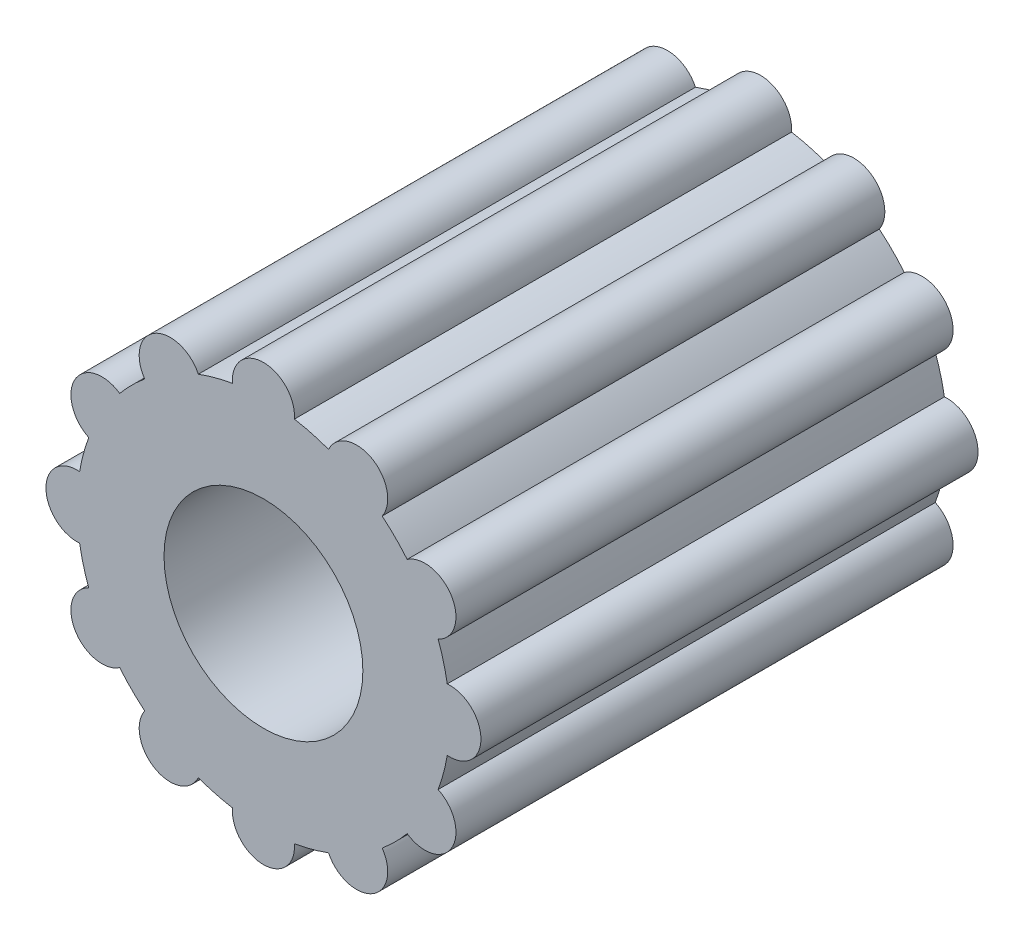
ISO-10303-21;
HEADER;
FILE_DESCRIPTION(('STEP AP214'),'2;1');
FILE_NAME('part.step','',(''),(''),'','','');
FILE_SCHEMA(('AUTOMOTIVE_DESIGN { 1 0 10303 214 1 1 1 1 }'));
ENDSEC;
DATA;
#1=APPLICATION_CONTEXT('core data for automotive mechanical design processes');
#2=APPLICATION_PROTOCOL_DEFINITION('international standard','automotive_design',2000,#1);
#3=PRODUCT_CONTEXT('',#1,'mechanical');
#4=PRODUCT('Part','Part','',(#3));
#5=PRODUCT_RELATED_PRODUCT_CATEGORY('part','',(#4));
#6=PRODUCT_DEFINITION_FORMATION('','',#4);
#7=PRODUCT_DEFINITION_CONTEXT('part definition',#1,'design');
#8=PRODUCT_DEFINITION('design','',#6,#7);
#9=PRODUCT_DEFINITION_SHAPE('','',#8);
#10=(LENGTH_UNIT() NAMED_UNIT(*) SI_UNIT(.MILLI.,.METRE.));
#11=(NAMED_UNIT(*) PLANE_ANGLE_UNIT() SI_UNIT($,.RADIAN.));
#12=(NAMED_UNIT(*) SI_UNIT($,.STERADIAN.) SOLID_ANGLE_UNIT());
#13=UNCERTAINTY_MEASURE_WITH_UNIT(LENGTH_MEASURE(1.E-05),#10,'distance_accuracy_value','');
#14=(GEOMETRIC_REPRESENTATION_CONTEXT(3) GLOBAL_UNCERTAINTY_ASSIGNED_CONTEXT((#13)) GLOBAL_UNIT_ASSIGNED_CONTEXT((#10,
#11,#12)) REPRESENTATION_CONTEXT('',''));
#15=CARTESIAN_POINT('',(0.,0.,0.));
#16=DIRECTION('',(0.,0.,1.));
#17=DIRECTION('',(1.,0.,0.));
#18=AXIS2_PLACEMENT_3D('',#15,#16,#17);
#19=CARTESIAN_POINT('',(0.,0.750000000000084,3.99999999999997));
#20=DIRECTION('',(0.,0.,0.999999999999981));
#21=DIRECTION('',(1.,0.,0.));
#22=AXIS2_PLACEMENT_3D('',#19,#20,#21);
#23=PLANE('',#22);
#24=CARTESIAN_POINT('',(0.,0.,3.99999999999996));
#25=DIRECTION('',(0.,0.,0.999999999999981));
#26=DIRECTION('',(1.,0.,0.));
#27=AXIS2_PLACEMENT_3D('',#24,#25,#26);
#28=CIRCLE('',#27,1.5);
#29=CARTESIAN_POINT('',(0.52383005023733,1.40556112583846,4.00000000000002));
#30=VERTEX_POINT('',#29);
#31=CARTESIAN_POINT('',(0.249130432147845,1.47916666666667,4.00000000000005));
#32=VERTEX_POINT('',#31);
#33=EDGE_CURVE('E293',#30,#32,#28,.T.);
#34=ORIENTED_EDGE('',*,*,#33,.T.);
#35=CARTESIAN_POINT('',(-1.25767452008319E-13,1.5000000000001,3.99999999999999));
#36=DIRECTION('',(0.,0.,0.999999999999981));
#37=DIRECTION('',(1.,0.,0.));
#38=AXIS2_PLACEMENT_3D('',#35,#36,#37);
#39=CIRCLE('',#38,0.25);
#40=CARTESIAN_POINT('',(-0.249130432148013,1.47916666666679,4.00000000000002));
#41=VERTEX_POINT('',#40);
#42=EDGE_CURVE('E161',#32,#41,#39,.T.);
#43=ORIENTED_EDGE('',*,*,#42,.T.);
#44=CARTESIAN_POINT('',(0.,0.,3.99999999999996));
#45=DIRECTION('',(0.,0.,0.999999999999981));
#46=DIRECTION('',(1.,0.,0.));
#47=AXIS2_PLACEMENT_3D('',#44,#45,#46);
#48=CIRCLE('',#47,1.49999999999999);
#49=CARTESIAN_POINT('',(-0.523830050237603,1.40556112583858,4.00000000000004));
#50=VERTEX_POINT('',#49);
#51=EDGE_CURVE('E356',#41,#50,#48,.T.);
#52=ORIENTED_EDGE('',*,*,#51,.T.);
#53=CARTESIAN_POINT('',(-0.750000000000156,1.29903810567679,4.00000000000001));
#54=DIRECTION('',(0.,0.,0.999999999999981));
#55=DIRECTION('',(1.,0.,0.));
#56=AXIS2_PLACEMENT_3D('',#53,#54,#55);
#57=CIRCLE('',#56,0.25);
#58=CARTESIAN_POINT('',(-0.955336616429422,1.15643069369062,4.00000000000003));
#59=VERTEX_POINT('',#58);
#60=EDGE_CURVE('E375',#50,#59,#57,.T.);
#61=ORIENTED_EDGE('',*,*,#60,.T.);
#62=CARTESIAN_POINT('',(0.,0.,3.99999999999996));
#63=DIRECTION('',(0.,0.,0.999999999999981));
#64=DIRECTION('',(1.,0.,0.));
#65=AXIS2_PLACEMENT_3D('',#62,#63,#64);
#66=CIRCLE('',#65,1.5);
#67=CARTESIAN_POINT('',(-1.15643069369056,0.955336616429329,4.));
#68=VERTEX_POINT('',#67);
#69=EDGE_CURVE('E372',#59,#68,#66,.T.);
#70=ORIENTED_EDGE('',*,*,#69,.T.);
#71=CARTESIAN_POINT('',(-1.29903810567668,0.750000000000039,3.99999999999996));
#72=DIRECTION('',(0.,0.,0.999999999999981));
#73=DIRECTION('',(1.,0.,0.));
#74=AXIS2_PLACEMENT_3D('',#71,#72,#73);
#75=CIRCLE('',#74,0.25);
#76=CARTESIAN_POINT('',(-1.40556112583854,0.523830050237404,3.99999999999998));
#77=VERTEX_POINT('',#76);
#78=EDGE_CURVE('E374',#68,#77,#75,.T.);
#79=ORIENTED_EDGE('',*,*,#78,.T.);
#80=CARTESIAN_POINT('',(0.,0.,3.99999999999996));
#81=DIRECTION('',(0.,0.,0.999999999999981));
#82=DIRECTION('',(1.,0.,0.));
#83=AXIS2_PLACEMENT_3D('',#80,#81,#82);
#84=CIRCLE('',#83,1.5);
#85=CARTESIAN_POINT('',(-1.47916666666678,0.24913043214795,3.99999999999995));
#86=VERTEX_POINT('',#85);
#87=EDGE_CURVE('E377',#77,#86,#84,.T.);
#88=ORIENTED_EDGE('',*,*,#87,.T.);
#89=CARTESIAN_POINT('',(-1.50000000000004,0.,4.));
#90=DIRECTION('',(0.,0.,0.999999999999981));
#91=DIRECTION('',(1.,0.,0.));
#92=AXIS2_PLACEMENT_3D('',#89,#90,#91);
#93=CIRCLE('',#92,0.25);
#94=CARTESIAN_POINT('',(-1.47916666666671,-0.249130432147932,3.99999999999996));
#95=VERTEX_POINT('',#94);
#96=EDGE_CURVE('E383',#86,#95,#93,.T.);
#97=ORIENTED_EDGE('',*,*,#96,.T.);
#98=CARTESIAN_POINT('',(0.,0.,3.99999999999996));
#99=DIRECTION('',(0.,0.,0.999999999999981));
#100=DIRECTION('',(1.,0.,0.));
#101=AXIS2_PLACEMENT_3D('',#98,#99,#100);
#102=CIRCLE('',#101,1.49999999999999);
#103=CARTESIAN_POINT('',(-1.40556112583857,-0.523830050237439,3.99999999999996));
#104=VERTEX_POINT('',#103);
#105=EDGE_CURVE('E385',#95,#104,#102,.T.);
#106=ORIENTED_EDGE('',*,*,#105,.T.);
#107=CARTESIAN_POINT('',(-1.29903810567671,-0.749999999999966,3.99999999999998));
#108=DIRECTION('',(0.,0.,0.999999999999981));
#109=DIRECTION('',(1.,0.,0.));
#110=AXIS2_PLACEMENT_3D('',#107,#108,#109);
#111=CIRCLE('',#110,0.25);
#112=CARTESIAN_POINT('',(-1.1564306936905,-0.955336616429187,3.99999999999998));
#113=VERTEX_POINT('',#112);
#114=EDGE_CURVE('E387',#104,#113,#111,.T.);
#115=ORIENTED_EDGE('',*,*,#114,.T.);
#116=CARTESIAN_POINT('',(0.,0.,3.99999999999996));
#117=DIRECTION('',(0.,0.,0.999999999999981));
#118=DIRECTION('',(1.,0.,0.));
#119=AXIS2_PLACEMENT_3D('',#116,#117,#118);
#120=CIRCLE('',#119,1.5);
#121=CARTESIAN_POINT('',(-0.955336616429346,-1.15643069369051,4.));
#122=VERTEX_POINT('',#121);
#123=EDGE_CURVE('E389',#113,#122,#120,.T.);
#124=ORIENTED_EDGE('',*,*,#123,.T.);
#125=CARTESIAN_POINT('',(-0.750000000000119,-1.29903810567669,4.));
#126=DIRECTION('',(0.,0.,0.999999999999981));
#127=DIRECTION('',(1.,0.,0.));
#128=AXIS2_PLACEMENT_3D('',#125,#126,#127);
#129=CIRCLE('',#128,0.25);
#130=CARTESIAN_POINT('',(-0.523830050237574,-1.40556112583836,4.00000000000001));
#131=VERTEX_POINT('',#130);
#132=EDGE_CURVE('E391',#122,#131,#129,.T.);
#133=ORIENTED_EDGE('',*,*,#132,.T.);
#134=CARTESIAN_POINT('',(0.,0.,3.99999999999996));
#135=DIRECTION('',(0.,0.,0.999999999999981));
#136=DIRECTION('',(1.,0.,0.));
#137=AXIS2_PLACEMENT_3D('',#134,#135,#136);
#138=CIRCLE('',#137,1.5);
#139=CARTESIAN_POINT('',(-0.249130432148061,-1.47916666666654,3.99999999999996));
#140=VERTEX_POINT('',#139);
#141=EDGE_CURVE('E393',#131,#140,#138,.T.);
#142=ORIENTED_EDGE('',*,*,#141,.T.);
#143=CARTESIAN_POINT('',(0.,-1.50000000000003,4.00000000000001));
#144=DIRECTION('',(0.,0.,0.999999999999981));
#145=DIRECTION('',(1.,0.,0.));
#146=AXIS2_PLACEMENT_3D('',#143,#144,#145);
#147=CIRCLE('',#146,0.25);
#148=CARTESIAN_POINT('',(0.249130432147785,-1.47916666666668,3.99999999999997));
#149=VERTEX_POINT('',#148);
#150=EDGE_CURVE('E395',#140,#149,#147,.T.);
#151=ORIENTED_EDGE('',*,*,#150,.T.);
#152=CARTESIAN_POINT('',(0.,0.,3.99999999999996));
#153=DIRECTION('',(0.,0.,0.999999999999981));
#154=DIRECTION('',(1.,0.,0.));
#155=AXIS2_PLACEMENT_3D('',#152,#153,#154);
#156=CIRCLE('',#155,1.5);
#157=CARTESIAN_POINT('',(0.52383005023729,-1.4055611258384,4.));
#158=VERTEX_POINT('',#157);
#159=EDGE_CURVE('E397',#149,#158,#156,.T.);
#160=ORIENTED_EDGE('',*,*,#159,.T.);
#161=CARTESIAN_POINT('',(0.750000000000028,-1.29903810567655,4.));
#162=DIRECTION('',(0.,0.,0.999999999999981));
#163=DIRECTION('',(1.,0.,0.));
#164=AXIS2_PLACEMENT_3D('',#161,#162,#163);
#165=CIRCLE('',#164,0.25);
#166=CARTESIAN_POINT('',(0.955336616429257,-1.15643069369045,4.00000000000001));
#167=VERTEX_POINT('',#166);
#168=EDGE_CURVE('E399',#158,#167,#165,.T.);
#169=ORIENTED_EDGE('',*,*,#168,.T.);
#170=CARTESIAN_POINT('',(0.,0.,3.99999999999996));
#171=DIRECTION('',(0.,0.,0.999999999999981));
#172=DIRECTION('',(1.,0.,0.));
#173=AXIS2_PLACEMENT_3D('',#170,#171,#172);
#174=CIRCLE('',#173,1.5);
#175=CARTESIAN_POINT('',(1.15643069369054,-0.955336616429082,3.99999999999998));
#176=VERTEX_POINT('',#175);
#177=EDGE_CURVE('E401',#167,#176,#174,.T.);
#178=ORIENTED_EDGE('',*,*,#177,.T.);
#179=CARTESIAN_POINT('',(1.29903810567669,-0.749999999999976,4.));
#180=DIRECTION('',(0.,0.,0.999999999999981));
#181=DIRECTION('',(1.,0.,0.));
#182=AXIS2_PLACEMENT_3D('',#179,#180,#181);
#183=CIRCLE('',#182,0.25);
#184=CARTESIAN_POINT('',(1.40556112583831,-0.523830050237293,4.00000000000001));
#185=VERTEX_POINT('',#184);
#186=EDGE_CURVE('E403',#176,#185,#183,.T.);
#187=ORIENTED_EDGE('',*,*,#186,.T.);
#188=CARTESIAN_POINT('',(0.,0.,3.99999999999996));
#189=DIRECTION('',(0.,0.,0.999999999999981));
#190=DIRECTION('',(1.,0.,0.));
#191=AXIS2_PLACEMENT_3D('',#188,#189,#190);
#192=CIRCLE('',#191,1.5);
#193=CARTESIAN_POINT('',(1.47916666666659,-0.249130432147835,4.));
#194=VERTEX_POINT('',#193);
#195=EDGE_CURVE('E405',#185,#194,#192,.T.);
#196=ORIENTED_EDGE('',*,*,#195,.T.);
#197=CARTESIAN_POINT('',(1.49999999999999,0.,4.00000000000002));
#198=DIRECTION('',(0.,0.,0.999999999999981));
#199=DIRECTION('',(1.,0.,0.));
#200=AXIS2_PLACEMENT_3D('',#197,#198,#199);
#201=CIRCLE('',#200,0.25);
#202=CARTESIAN_POINT('',(1.47916666666648,0.249130432147967,3.99999999999996));
#203=VERTEX_POINT('',#202);
#204=EDGE_CURVE('E407',#194,#203,#201,.T.);
#205=ORIENTED_EDGE('',*,*,#204,.T.);
#206=CARTESIAN_POINT('',(0.,0.,3.99999999999996));
#207=DIRECTION('',(0.,0.,0.999999999999981));
#208=DIRECTION('',(1.,0.,0.));
#209=AXIS2_PLACEMENT_3D('',#206,#207,#208);
#210=CIRCLE('',#209,1.5);
#211=CARTESIAN_POINT('',(1.40556112583846,0.523830050237446,3.99999999999997));
#212=VERTEX_POINT('',#211);
#213=EDGE_CURVE('E228',#203,#212,#210,.T.);
#214=ORIENTED_EDGE('',*,*,#213,.T.);
#215=CARTESIAN_POINT('',(1.29903810567657,0.749999999999962,3.99999999999998));
#216=DIRECTION('',(0.,0.,0.999999999999981));
#217=DIRECTION('',(1.,0.,0.));
#218=AXIS2_PLACEMENT_3D('',#215,#216,#217);
#219=CIRCLE('',#218,0.25);
#220=CARTESIAN_POINT('',(1.15643069369041,0.955336616429409,4.));
#221=VERTEX_POINT('',#220);
#222=EDGE_CURVE('E222',#212,#221,#219,.T.);
#223=ORIENTED_EDGE('',*,*,#222,.T.);
#224=CARTESIAN_POINT('',(0.,0.,3.99999999999996));
#225=DIRECTION('',(0.,0.,0.999999999999981));
#226=DIRECTION('',(1.,0.,0.));
#227=AXIS2_PLACEMENT_3D('',#224,#225,#226);
#228=CIRCLE('',#227,1.5);
#229=CARTESIAN_POINT('',(0.955336616429131,1.15643069369062,4.00000000000006));
#230=VERTEX_POINT('',#229);
#231=EDGE_CURVE('E226',#221,#230,#228,.T.);
#232=ORIENTED_EDGE('',*,*,#231,.T.);
#233=CARTESIAN_POINT('',(0.749999999999856,1.2990381056768,4.00000000000005));
#234=DIRECTION('',(0.,0.,0.999999999999981));
#235=DIRECTION('',(1.,0.,0.));
#236=AXIS2_PLACEMENT_3D('',#233,#234,#235);
#237=CIRCLE('',#236,0.25);
#238=EDGE_CURVE('E70',#230,#30,#237,.T.);
#239=ORIENTED_EDGE('',*,*,#238,.T.);
#240=EDGE_LOOP('',(#34,#43,#52,#61,#70,#79,#88,#97,#106,#115,#124,#133,#142,#151,#160,#169,#178,
#187,#196,#205,#214,#223,#232,#239));
#241=FACE_BOUND('',#240,.T.);
#242=CARTESIAN_POINT('',(0.,0.,3.99999999999994));
#243=DIRECTION('',(0.,0.,-0.999999999999981));
#244=DIRECTION('',(-1.,0.,0.));
#245=AXIS2_PLACEMENT_3D('',#242,#243,#244);
#246=CIRCLE('',#245,0.799999999999999);
#247=CARTESIAN_POINT('',(-0.800000000000037,0.,3.99999999999994));
#248=VERTEX_POINT('',#247);
#249=EDGE_CURVE('E250',#248,#248,#246,.T.);
#250=ORIENTED_EDGE('',*,*,#249,.T.);
#251=EDGE_LOOP('',(#250));
#252=FACE_BOUND('',#251,.T.);
#253=ADVANCED_FACE('F53',(#241,#252),#23,.T.);
#254=CARTESIAN_POINT('',(-1.10154940724527E-13,0.75000000000006,0.));
#255=DIRECTION('',(0.,0.,0.999999999999981));
#256=DIRECTION('',(1.,0.,0.));
#257=AXIS2_PLACEMENT_3D('',#254,#255,#256);
#258=PLANE('',#257);
#259=CARTESIAN_POINT('',(0.,0.,0.));
#260=DIRECTION('',(0.,0.,0.999999999999981));
#261=DIRECTION('',(1.,0.,0.));
#262=AXIS2_PLACEMENT_3D('',#259,#260,#261);
#263=CIRCLE('',#262,1.5);
#264=CARTESIAN_POINT('',(0.523830050237322,1.4055611258385,0.));
#265=VERTEX_POINT('',#264);
#266=CARTESIAN_POINT('',(0.249130432147879,1.4791666666667,0.));
#267=VERTEX_POINT('',#266);
#268=EDGE_CURVE('E246',#265,#267,#263,.T.);
#269=ORIENTED_EDGE('',*,*,#268,.F.);
#270=CARTESIAN_POINT('',(0.749999999999891,1.2990381056768,0.));
#271=DIRECTION('',(0.,0.,0.999999999999981));
#272=DIRECTION('',(1.,0.,0.));
#273=AXIS2_PLACEMENT_3D('',#270,#271,#272);
#274=CIRCLE('',#273,0.25);
#275=CARTESIAN_POINT('',(0.955336616429159,1.1564306936906,0.));
#276=VERTEX_POINT('',#275);
#277=EDGE_CURVE('E153',#276,#265,#274,.T.);
#278=ORIENTED_EDGE('',*,*,#277,.F.);
#279=CARTESIAN_POINT('',(0.,0.,0.));
#280=DIRECTION('',(0.,0.,0.999999999999981));
#281=DIRECTION('',(1.,0.,0.));
#282=AXIS2_PLACEMENT_3D('',#279,#280,#281);
#283=CIRCLE('',#282,1.5);
#284=CARTESIAN_POINT('',(1.15643069369041,0.95533661642945,0.));
#285=VERTEX_POINT('',#284);
#286=EDGE_CURVE('E147',#285,#276,#283,.T.);
#287=ORIENTED_EDGE('',*,*,#286,.F.);
#288=CARTESIAN_POINT('',(1.29903810567659,0.750000000000032,0.));
#289=DIRECTION('',(0.,0.,0.999999999999981));
#290=DIRECTION('',(1.,0.,0.));
#291=AXIS2_PLACEMENT_3D('',#288,#289,#290);
#292=CIRCLE('',#291,0.25);
#293=CARTESIAN_POINT('',(1.4055611258384,0.52383005023747,0.));
#294=VERTEX_POINT('',#293);
#295=EDGE_CURVE('E236',#294,#285,#292,.T.);
#296=ORIENTED_EDGE('',*,*,#295,.F.);
#297=CARTESIAN_POINT('',(0.,0.,0.));
#298=DIRECTION('',(0.,0.,0.999999999999981));
#299=DIRECTION('',(1.,0.,0.));
#300=AXIS2_PLACEMENT_3D('',#297,#298,#299);
#301=CIRCLE('',#300,1.5);
#302=CARTESIAN_POINT('',(1.47916666666643,0.249130432148002,0.));
#303=VERTEX_POINT('',#302);
#304=EDGE_CURVE('E288',#303,#294,#301,.T.);
#305=ORIENTED_EDGE('',*,*,#304,.F.);
#306=CARTESIAN_POINT('',(1.50000000000002,0.,0.));
#307=DIRECTION('',(0.,0.,0.999999999999981));
#308=DIRECTION('',(1.,0.,0.));
#309=AXIS2_PLACEMENT_3D('',#306,#307,#308);
#310=CIRCLE('',#309,0.25);
#311=CARTESIAN_POINT('',(1.47916666666655,-0.249130432147849,0.));
#312=VERTEX_POINT('',#311);
#313=EDGE_CURVE('E286',#312,#303,#310,.T.);
#314=ORIENTED_EDGE('',*,*,#313,.F.);
#315=CARTESIAN_POINT('',(0.,0.,0.));
#316=DIRECTION('',(0.,0.,0.999999999999981));
#317=DIRECTION('',(1.,0.,0.));
#318=AXIS2_PLACEMENT_3D('',#315,#316,#317);
#319=CIRCLE('',#318,1.5);
#320=CARTESIAN_POINT('',(1.40556112583835,-0.523830050237314,0.));
#321=VERTEX_POINT('',#320);
#322=EDGE_CURVE('E284',#321,#312,#319,.T.);
#323=ORIENTED_EDGE('',*,*,#322,.F.);
#324=CARTESIAN_POINT('',(1.29903810567667,-0.7499999999999,0.));
#325=DIRECTION('',(0.,0.,0.999999999999981));
#326=DIRECTION('',(1.,0.,0.));
#327=AXIS2_PLACEMENT_3D('',#324,#325,#326);
#328=CIRCLE('',#327,0.25);
#329=CARTESIAN_POINT('',(1.15643069369045,-0.955336616429086,0.));
#330=VERTEX_POINT('',#329);
#331=EDGE_CURVE('E282',#330,#321,#328,.T.);
#332=ORIENTED_EDGE('',*,*,#331,.F.);
#333=CARTESIAN_POINT('',(0.,0.,0.));
#334=DIRECTION('',(0.,0.,0.999999999999981));
#335=DIRECTION('',(1.,0.,0.));
#336=AXIS2_PLACEMENT_3D('',#333,#334,#335);
#337=CIRCLE('',#336,1.5);
#338=CARTESIAN_POINT('',(0.955336616429312,-1.15643069369037,0.));
#339=VERTEX_POINT('',#338);
#340=EDGE_CURVE('E280',#339,#330,#337,.T.);
#341=ORIENTED_EDGE('',*,*,#340,.F.);
#342=CARTESIAN_POINT('',(0.749999999999987,-1.29903810567648,0.));
#343=DIRECTION('',(0.,0.,0.999999999999981));
#344=DIRECTION('',(1.,0.,0.));
#345=AXIS2_PLACEMENT_3D('',#342,#343,#344);
#346=CIRCLE('',#345,0.25);
#347=CARTESIAN_POINT('',(0.523830050237205,-1.40556112583839,0.));
#348=VERTEX_POINT('',#347);
#349=EDGE_CURVE('E278',#348,#339,#346,.T.);
#350=ORIENTED_EDGE('',*,*,#349,.F.);
#351=CARTESIAN_POINT('',(0.,0.,0.));
#352=DIRECTION('',(0.,0.,0.999999999999981));
#353=DIRECTION('',(1.,0.,0.));
#354=AXIS2_PLACEMENT_3D('',#351,#352,#353);
#355=CIRCLE('',#354,1.5);
#356=CARTESIAN_POINT('',(0.249130432147784,-1.47916666666665,0.));
#357=VERTEX_POINT('',#356);
#358=EDGE_CURVE('E276',#357,#348,#355,.T.);
#359=ORIENTED_EDGE('',*,*,#358,.F.);
#360=CARTESIAN_POINT('',(0.,-1.50000000000003,0.));
#361=DIRECTION('',(0.,0.,0.999999999999981));
#362=DIRECTION('',(1.,0.,0.));
#363=AXIS2_PLACEMENT_3D('',#360,#361,#362);
#364=CIRCLE('',#363,0.25);
#365=CARTESIAN_POINT('',(-0.249130432148178,-1.4791666666665,0.));
#366=VERTEX_POINT('',#365);
#367=EDGE_CURVE('E274',#366,#357,#364,.T.);
#368=ORIENTED_EDGE('',*,*,#367,.F.);
#369=CARTESIAN_POINT('',(0.,0.,0.));
#370=DIRECTION('',(0.,0.,0.999999999999981));
#371=DIRECTION('',(1.,0.,0.));
#372=AXIS2_PLACEMENT_3D('',#369,#370,#371);
#373=CIRCLE('',#372,1.5);
#374=CARTESIAN_POINT('',(-0.523830050237587,-1.40556112583835,0.));
#375=VERTEX_POINT('',#374);
#376=EDGE_CURVE('E272',#375,#366,#373,.T.);
#377=ORIENTED_EDGE('',*,*,#376,.F.);
#378=CARTESIAN_POINT('',(-0.75000000000018,-1.29903810567662,0.));
#379=DIRECTION('',(0.,0.,0.999999999999981));
#380=DIRECTION('',(1.,0.,0.));
#381=AXIS2_PLACEMENT_3D('',#378,#379,#380);
#382=CIRCLE('',#381,0.25);
#383=CARTESIAN_POINT('',(-0.955336616429324,-1.15643069369045,0.));
#384=VERTEX_POINT('',#383);
#385=EDGE_CURVE('E270',#384,#375,#382,.T.);
#386=ORIENTED_EDGE('',*,*,#385,.F.);
#387=CARTESIAN_POINT('',(0.,0.,0.));
#388=DIRECTION('',(0.,0.,0.999999999999981));
#389=DIRECTION('',(1.,0.,0.));
#390=AXIS2_PLACEMENT_3D('',#387,#388,#389);
#391=CIRCLE('',#390,1.5);
#392=CARTESIAN_POINT('',(-1.15643069369051,-0.955336616429117,0.));
#393=VERTEX_POINT('',#392);
#394=EDGE_CURVE('E268',#393,#384,#391,.T.);
#395=ORIENTED_EDGE('',*,*,#394,.F.);
#396=CARTESIAN_POINT('',(-1.2990381056767,-0.749999999999942,0.));
#397=DIRECTION('',(0.,0.,0.999999999999981));
#398=DIRECTION('',(1.,0.,0.));
#399=AXIS2_PLACEMENT_3D('',#396,#397,#398);
#400=CIRCLE('',#399,0.25);
#401=CARTESIAN_POINT('',(-1.40556112583855,-0.523830050237355,0.));
#402=VERTEX_POINT('',#401);
#403=EDGE_CURVE('E266',#402,#393,#400,.T.);
#404=ORIENTED_EDGE('',*,*,#403,.F.);
#405=CARTESIAN_POINT('',(0.,0.,0.));
#406=DIRECTION('',(0.,0.,0.999999999999981));
#407=DIRECTION('',(1.,0.,0.));
#408=AXIS2_PLACEMENT_3D('',#405,#406,#407);
#409=CIRCLE('',#408,1.49999999999999);
#410=CARTESIAN_POINT('',(-1.4791666666667,-0.249130432147911,0.));
#411=VERTEX_POINT('',#410);
#412=EDGE_CURVE('E264',#411,#402,#409,.T.);
#413=ORIENTED_EDGE('',*,*,#412,.F.);
#414=CARTESIAN_POINT('',(-1.5000000000001,0.,0.));
#415=DIRECTION('',(0.,0.,0.999999999999981));
#416=DIRECTION('',(1.,0.,0.));
#417=AXIS2_PLACEMENT_3D('',#414,#415,#416);
#418=CIRCLE('',#417,0.25);
#419=CARTESIAN_POINT('',(-1.47916666666672,0.249130432147998,0.));
#420=VERTEX_POINT('',#419);
#421=EDGE_CURVE('E262',#420,#411,#418,.T.);
#422=ORIENTED_EDGE('',*,*,#421,.F.);
#423=CARTESIAN_POINT('',(0.,0.,0.));
#424=DIRECTION('',(0.,0.,0.999999999999981));
#425=DIRECTION('',(1.,0.,0.));
#426=AXIS2_PLACEMENT_3D('',#423,#424,#425);
#427=CIRCLE('',#426,1.5);
#428=CARTESIAN_POINT('',(-1.40556112583856,0.523830050237442,0.));
#429=VERTEX_POINT('',#428);
#430=EDGE_CURVE('E260',#429,#420,#427,.T.);
#431=ORIENTED_EDGE('',*,*,#430,.F.);
#432=CARTESIAN_POINT('',(-1.29903810567672,0.750000000000035,0.));
#433=DIRECTION('',(0.,0.,0.999999999999981));
#434=DIRECTION('',(1.,0.,0.));
#435=AXIS2_PLACEMENT_3D('',#432,#433,#434);
#436=CIRCLE('',#435,0.25);
#437=CARTESIAN_POINT('',(-1.15643069369062,0.955336616429415,0.));
#438=VERTEX_POINT('',#437);
#439=EDGE_CURVE('E258',#438,#429,#436,.T.);
#440=ORIENTED_EDGE('',*,*,#439,.F.);
#441=CARTESIAN_POINT('',(0.,0.,0.));
#442=DIRECTION('',(0.,0.,0.999999999999981));
#443=DIRECTION('',(1.,0.,0.));
#444=AXIS2_PLACEMENT_3D('',#441,#442,#443);
#445=CIRCLE('',#444,1.5);
#446=CARTESIAN_POINT('',(-0.955336616429402,1.15643069369063,0.));
#447=VERTEX_POINT('',#446);
#448=EDGE_CURVE('E256',#447,#438,#445,.T.);
#449=ORIENTED_EDGE('',*,*,#448,.F.);
#450=CARTESIAN_POINT('',(-0.750000000000161,1.29903810567679,0.));
#451=DIRECTION('',(0.,0.,0.999999999999981));
#452=DIRECTION('',(1.,0.,0.));
#453=AXIS2_PLACEMENT_3D('',#450,#451,#452);
#454=CIRCLE('',#453,0.25);
#455=CARTESIAN_POINT('',(-0.52383005023761,1.40556112583861,0.));
#456=VERTEX_POINT('',#455);
#457=EDGE_CURVE('E254',#456,#447,#454,.T.);
#458=ORIENTED_EDGE('',*,*,#457,.F.);
#459=CARTESIAN_POINT('',(0.,0.,0.));
#460=DIRECTION('',(0.,0.,0.999999999999981));
#461=DIRECTION('',(1.,0.,0.));
#462=AXIS2_PLACEMENT_3D('',#459,#460,#461);
#463=CIRCLE('',#462,1.49999999999999);
#464=CARTESIAN_POINT('',(-0.249130432147971,1.47916666666682,0.));
#465=VERTEX_POINT('',#464);
#466=EDGE_CURVE('E252',#465,#456,#463,.T.);
#467=ORIENTED_EDGE('',*,*,#466,.F.);
#468=CARTESIAN_POINT('',(-1.17961196366423E-13,1.50000000000015,0.));
#469=DIRECTION('',(0.,0.,0.999999999999981));
#470=DIRECTION('',(1.,0.,0.));
#471=AXIS2_PLACEMENT_3D('',#468,#469,#470);
#472=CIRCLE('',#471,0.25);
#473=EDGE_CURVE('E249',#267,#465,#472,.T.);
#474=ORIENTED_EDGE('',*,*,#473,.F.);
#475=EDGE_LOOP('',(#269,#278,#287,#296,#305,#314,#323,#332,#341,#350,#359,#368,#377,#386,#395,
#404,#413,#422,#431,#440,#449,#458,#467,#474));
#476=FACE_BOUND('',#475,.T.);
#477=CARTESIAN_POINT('',(0.,0.,0.));
#478=DIRECTION('',(0.,0.,-0.999999999999981));
#479=DIRECTION('',(-1.,0.,0.));
#480=AXIS2_PLACEMENT_3D('',#477,#478,#479);
#481=CIRCLE('',#480,0.799999999999988);
#482=CARTESIAN_POINT('',(-0.800000000000037,0.,0.));
#483=VERTEX_POINT('',#482);
#484=EDGE_CURVE('E712',#483,#483,#481,.T.);
#485=ORIENTED_EDGE('',*,*,#484,.F.);
#486=EDGE_LOOP('',(#485));
#487=FACE_BOUND('',#486,.T.);
#488=ADVANCED_FACE('F360',(#476,#487),#258,.F.);
#489=CARTESIAN_POINT('',(0.,0.,3.99999999999996));
#490=DIRECTION('',(0.,0.,-0.999999999999981));
#491=DIRECTION('',(-1.,0.,0.));
#492=AXIS2_PLACEMENT_3D('',#489,#490,#491);
#493=CYLINDRICAL_SURFACE('',#492,1.5);
#494=ORIENTED_EDGE('',*,*,#268,.T.);
#495=DIRECTION('',(0.,0.,-0.999999999999981));
#496=VECTOR('',#495,1.);
#497=CARTESIAN_POINT('',(0.249130432147845,1.47916666666667,4.00000000000005));
#498=LINE('',#497,#496);
#499=EDGE_CURVE('E13',#32,#267,#498,.T.);
#500=ORIENTED_EDGE('',*,*,#499,.F.);
#501=ORIENTED_EDGE('',*,*,#33,.F.);
#502=DIRECTION('',(0.,0.,-0.999999999999981));
#503=VECTOR('',#502,1.);
#504=CARTESIAN_POINT('',(0.52383005023733,1.40556112583846,4.00000000000002));
#505=LINE('',#504,#503);
#506=EDGE_CURVE('E242',#30,#265,#505,.T.);
#507=ORIENTED_EDGE('',*,*,#506,.T.);
#508=EDGE_LOOP('',(#494,#500,#501,#507));
#509=FACE_BOUND('',#508,.T.);
#510=ADVANCED_FACE('F55',(#509),#493,.T.);
#511=CARTESIAN_POINT('',(-1.25767452008319E-13,1.5000000000001,3.99999999999999));
#512=DIRECTION('',(0.,0.,-0.999999999999981));
#513=DIRECTION('',(-1.,0.,0.));
#514=AXIS2_PLACEMENT_3D('',#511,#512,#513);
#515=CYLINDRICAL_SURFACE('',#514,0.25);
#516=ORIENTED_EDGE('',*,*,#473,.T.);
#517=DIRECTION('',(0.,0.,-0.999999999999981));
#518=VECTOR('',#517,1.);
#519=CARTESIAN_POINT('',(-0.249130432148013,1.47916666666679,4.00000000000002));
#520=LINE('',#519,#518);
#521=EDGE_CURVE('E62',#41,#465,#520,.T.);
#522=ORIENTED_EDGE('',*,*,#521,.F.);
#523=ORIENTED_EDGE('',*,*,#42,.F.);
#524=ORIENTED_EDGE('',*,*,#499,.T.);
#525=EDGE_LOOP('',(#516,#522,#523,#524));
#526=FACE_BOUND('',#525,.T.);
#527=ADVANCED_FACE('F441',(#526),#515,.T.);
#528=CARTESIAN_POINT('',(0.,0.,3.99999999999996));
#529=DIRECTION('',(0.,0.,-0.999999999999981));
#530=DIRECTION('',(-1.,0.,0.));
#531=AXIS2_PLACEMENT_3D('',#528,#529,#530);
#532=CYLINDRICAL_SURFACE('',#531,1.49999999999999);
#533=ORIENTED_EDGE('',*,*,#466,.T.);
#534=DIRECTION('',(0.,0.,-0.999999999999981));
#535=VECTOR('',#534,1.);
#536=CARTESIAN_POINT('',(-0.523830050237603,1.40556112583858,4.00000000000004));
#537=LINE('',#536,#535);
#538=EDGE_CURVE('E348',#50,#456,#537,.T.);
#539=ORIENTED_EDGE('',*,*,#538,.F.);
#540=ORIENTED_EDGE('',*,*,#51,.F.);
#541=ORIENTED_EDGE('',*,*,#521,.T.);
#542=EDGE_LOOP('',(#533,#539,#540,#541));
#543=FACE_BOUND('',#542,.T.);
#544=ADVANCED_FACE('F354',(#543),#532,.T.);
#545=CARTESIAN_POINT('',(-0.750000000000156,1.29903810567679,4.00000000000001));
#546=DIRECTION('',(0.,0.,-0.999999999999981));
#547=DIRECTION('',(-1.,0.,0.));
#548=AXIS2_PLACEMENT_3D('',#545,#546,#547);
#549=CYLINDRICAL_SURFACE('',#548,0.25);
#550=ORIENTED_EDGE('',*,*,#457,.T.);
#551=DIRECTION('',(0.,0.,-0.999999999999981));
#552=VECTOR('',#551,1.);
#553=CARTESIAN_POINT('',(-0.955336616429422,1.15643069369062,4.00000000000003));
#554=LINE('',#553,#552);
#555=EDGE_CURVE('E345',#59,#447,#554,.T.);
#556=ORIENTED_EDGE('',*,*,#555,.F.);
#557=ORIENTED_EDGE('',*,*,#60,.F.);
#558=ORIENTED_EDGE('',*,*,#538,.T.);
#559=EDGE_LOOP('',(#550,#556,#557,#558));
#560=FACE_BOUND('',#559,.T.);
#561=ADVANCED_FACE('F366',(#560),#549,.T.);
#562=CARTESIAN_POINT('',(0.,0.,3.99999999999996));
#563=DIRECTION('',(0.,0.,-0.999999999999981));
#564=DIRECTION('',(-1.,0.,0.));
#565=AXIS2_PLACEMENT_3D('',#562,#563,#564);
#566=CYLINDRICAL_SURFACE('',#565,1.5);
#567=ORIENTED_EDGE('',*,*,#448,.T.);
#568=DIRECTION('',(0.,0.,-0.999999999999981));
#569=VECTOR('',#568,1.);
#570=CARTESIAN_POINT('',(-1.15643069369056,0.955336616429329,4.));
#571=LINE('',#570,#569);
#572=EDGE_CURVE('E342',#68,#438,#571,.T.);
#573=ORIENTED_EDGE('',*,*,#572,.F.);
#574=ORIENTED_EDGE('',*,*,#69,.F.);
#575=ORIENTED_EDGE('',*,*,#555,.T.);
#576=EDGE_LOOP('',(#567,#573,#574,#575));
#577=FACE_BOUND('',#576,.T.);
#578=ADVANCED_FACE('F370',(#577),#566,.T.);
#579=CARTESIAN_POINT('',(-1.29903810567668,0.750000000000039,3.99999999999996));
#580=DIRECTION('',(0.,0.,-0.999999999999981));
#581=DIRECTION('',(-1.,0.,0.));
#582=AXIS2_PLACEMENT_3D('',#579,#580,#581);
#583=CYLINDRICAL_SURFACE('',#582,0.25);
#584=ORIENTED_EDGE('',*,*,#439,.T.);
#585=DIRECTION('',(0.,0.,-0.999999999999981));
#586=VECTOR('',#585,1.);
#587=CARTESIAN_POINT('',(-1.40556112583854,0.523830050237404,3.99999999999998));
#588=LINE('',#587,#586);
#589=EDGE_CURVE('E339',#77,#429,#588,.T.);
#590=ORIENTED_EDGE('',*,*,#589,.F.);
#591=ORIENTED_EDGE('',*,*,#78,.F.);
#592=ORIENTED_EDGE('',*,*,#572,.T.);
#593=EDGE_LOOP('',(#584,#590,#591,#592));
#594=FACE_BOUND('',#593,.T.);
#595=ADVANCED_FACE('F454',(#594),#583,.T.);
#596=CARTESIAN_POINT('',(0.,0.,3.99999999999996));
#597=DIRECTION('',(0.,0.,-0.999999999999981));
#598=DIRECTION('',(-1.,0.,0.));
#599=AXIS2_PLACEMENT_3D('',#596,#597,#598);
#600=CYLINDRICAL_SURFACE('',#599,1.5);
#601=ORIENTED_EDGE('',*,*,#430,.T.);
#602=DIRECTION('',(0.,0.,-0.999999999999981));
#603=VECTOR('',#602,1.);
#604=CARTESIAN_POINT('',(-1.47916666666678,0.24913043214795,3.99999999999995));
#605=LINE('',#604,#603);
#606=EDGE_CURVE('E336',#86,#420,#605,.T.);
#607=ORIENTED_EDGE('',*,*,#606,.F.);
#608=ORIENTED_EDGE('',*,*,#87,.F.);
#609=ORIENTED_EDGE('',*,*,#589,.T.);
#610=EDGE_LOOP('',(#601,#607,#608,#609));
#611=FACE_BOUND('',#610,.T.);
#612=ADVANCED_FACE('F457',(#611),#600,.T.);
#613=CARTESIAN_POINT('',(-1.50000000000004,0.,4.));
#614=DIRECTION('',(0.,0.,-0.999999999999981));
#615=DIRECTION('',(-1.,0.,0.));
#616=AXIS2_PLACEMENT_3D('',#613,#614,#615);
#617=CYLINDRICAL_SURFACE('',#616,0.25);
#618=ORIENTED_EDGE('',*,*,#421,.T.);
#619=DIRECTION('',(0.,0.,-0.999999999999981));
#620=VECTOR('',#619,1.);
#621=CARTESIAN_POINT('',(-1.47916666666671,-0.249130432147932,3.99999999999996));
#622=LINE('',#621,#620);
#623=EDGE_CURVE('E333',#95,#411,#622,.T.);
#624=ORIENTED_EDGE('',*,*,#623,.F.);
#625=ORIENTED_EDGE('',*,*,#96,.F.);
#626=ORIENTED_EDGE('',*,*,#606,.T.);
#627=EDGE_LOOP('',(#618,#624,#625,#626));
#628=FACE_BOUND('',#627,.T.);
#629=ADVANCED_FACE('F461',(#628),#617,.T.);
#630=CARTESIAN_POINT('',(0.,0.,3.99999999999996));
#631=DIRECTION('',(0.,0.,-0.999999999999981));
#632=DIRECTION('',(-1.,0.,0.));
#633=AXIS2_PLACEMENT_3D('',#630,#631,#632);
#634=CYLINDRICAL_SURFACE('',#633,1.49999999999999);
#635=ORIENTED_EDGE('',*,*,#412,.T.);
#636=DIRECTION('',(0.,0.,-0.999999999999981));
#637=VECTOR('',#636,1.);
#638=CARTESIAN_POINT('',(-1.40556112583857,-0.523830050237439,3.99999999999996));
#639=LINE('',#638,#637);
#640=EDGE_CURVE('E330',#104,#402,#639,.T.);
#641=ORIENTED_EDGE('',*,*,#640,.F.);
#642=ORIENTED_EDGE('',*,*,#105,.F.);
#643=ORIENTED_EDGE('',*,*,#623,.T.);
#644=EDGE_LOOP('',(#635,#641,#642,#643));
#645=FACE_BOUND('',#644,.T.);
#646=ADVANCED_FACE('F465',(#645),#634,.T.);
#647=CARTESIAN_POINT('',(-1.29903810567671,-0.749999999999966,3.99999999999998));
#648=DIRECTION('',(0.,0.,-0.999999999999981));
#649=DIRECTION('',(-1.,0.,0.));
#650=AXIS2_PLACEMENT_3D('',#647,#648,#649);
#651=CYLINDRICAL_SURFACE('',#650,0.25);
#652=ORIENTED_EDGE('',*,*,#403,.T.);
#653=DIRECTION('',(0.,0.,-0.999999999999981));
#654=VECTOR('',#653,1.);
#655=CARTESIAN_POINT('',(-1.1564306936905,-0.955336616429187,3.99999999999998));
#656=LINE('',#655,#654);
#657=EDGE_CURVE('E327',#113,#393,#656,.T.);
#658=ORIENTED_EDGE('',*,*,#657,.F.);
#659=ORIENTED_EDGE('',*,*,#114,.F.);
#660=ORIENTED_EDGE('',*,*,#640,.T.);
#661=EDGE_LOOP('',(#652,#658,#659,#660));
#662=FACE_BOUND('',#661,.T.);
#663=ADVANCED_FACE('F469',(#662),#651,.T.);
#664=CARTESIAN_POINT('',(0.,0.,3.99999999999996));
#665=DIRECTION('',(0.,0.,-0.999999999999981));
#666=DIRECTION('',(-1.,0.,0.));
#667=AXIS2_PLACEMENT_3D('',#664,#665,#666);
#668=CYLINDRICAL_SURFACE('',#667,1.5);
#669=ORIENTED_EDGE('',*,*,#394,.T.);
#670=DIRECTION('',(0.,0.,-0.999999999999981));
#671=VECTOR('',#670,1.);
#672=CARTESIAN_POINT('',(-0.955336616429346,-1.15643069369051,4.));
#673=LINE('',#672,#671);
#674=EDGE_CURVE('E324',#122,#384,#673,.T.);
#675=ORIENTED_EDGE('',*,*,#674,.F.);
#676=ORIENTED_EDGE('',*,*,#123,.F.);
#677=ORIENTED_EDGE('',*,*,#657,.T.);
#678=EDGE_LOOP('',(#669,#675,#676,#677));
#679=FACE_BOUND('',#678,.T.);
#680=ADVANCED_FACE('F473',(#679),#668,.T.);
#681=CARTESIAN_POINT('',(-0.750000000000119,-1.29903810567669,4.));
#682=DIRECTION('',(0.,0.,-0.999999999999981));
#683=DIRECTION('',(-1.,0.,0.));
#684=AXIS2_PLACEMENT_3D('',#681,#682,#683);
#685=CYLINDRICAL_SURFACE('',#684,0.25);
#686=ORIENTED_EDGE('',*,*,#385,.T.);
#687=DIRECTION('',(0.,0.,-0.999999999999981));
#688=VECTOR('',#687,1.);
#689=CARTESIAN_POINT('',(-0.523830050237574,-1.40556112583836,4.00000000000001));
#690=LINE('',#689,#688);
#691=EDGE_CURVE('E321',#131,#375,#690,.T.);
#692=ORIENTED_EDGE('',*,*,#691,.F.);
#693=ORIENTED_EDGE('',*,*,#132,.F.);
#694=ORIENTED_EDGE('',*,*,#674,.T.);
#695=EDGE_LOOP('',(#686,#692,#693,#694));
#696=FACE_BOUND('',#695,.T.);
#697=ADVANCED_FACE('F477',(#696),#685,.T.);
#698=CARTESIAN_POINT('',(0.,0.,3.99999999999996));
#699=DIRECTION('',(0.,0.,-0.999999999999981));
#700=DIRECTION('',(-1.,0.,0.));
#701=AXIS2_PLACEMENT_3D('',#698,#699,#700);
#702=CYLINDRICAL_SURFACE('',#701,1.5);
#703=ORIENTED_EDGE('',*,*,#376,.T.);
#704=DIRECTION('',(0.,0.,-0.999999999999981));
#705=VECTOR('',#704,1.);
#706=CARTESIAN_POINT('',(-0.249130432148061,-1.47916666666654,3.99999999999996));
#707=LINE('',#706,#705);
#708=EDGE_CURVE('E318',#140,#366,#707,.T.);
#709=ORIENTED_EDGE('',*,*,#708,.F.);
#710=ORIENTED_EDGE('',*,*,#141,.F.);
#711=ORIENTED_EDGE('',*,*,#691,.T.);
#712=EDGE_LOOP('',(#703,#709,#710,#711));
#713=FACE_BOUND('',#712,.T.);
#714=ADVANCED_FACE('F481',(#713),#702,.T.);
#715=CARTESIAN_POINT('',(0.,-1.50000000000003,4.00000000000001));
#716=DIRECTION('',(0.,0.,-0.999999999999981));
#717=DIRECTION('',(-1.,0.,0.));
#718=AXIS2_PLACEMENT_3D('',#715,#716,#717);
#719=CYLINDRICAL_SURFACE('',#718,0.25);
#720=ORIENTED_EDGE('',*,*,#367,.T.);
#721=DIRECTION('',(0.,0.,-0.999999999999981));
#722=VECTOR('',#721,1.);
#723=CARTESIAN_POINT('',(0.249130432147785,-1.47916666666668,3.99999999999997));
#724=LINE('',#723,#722);
#725=EDGE_CURVE('E315',#149,#357,#724,.T.);
#726=ORIENTED_EDGE('',*,*,#725,.F.);
#727=ORIENTED_EDGE('',*,*,#150,.F.);
#728=ORIENTED_EDGE('',*,*,#708,.T.);
#729=EDGE_LOOP('',(#720,#726,#727,#728));
#730=FACE_BOUND('',#729,.T.);
#731=ADVANCED_FACE('F485',(#730),#719,.T.);
#732=CARTESIAN_POINT('',(0.,0.,3.99999999999996));
#733=DIRECTION('',(0.,0.,-0.999999999999981));
#734=DIRECTION('',(-1.,0.,0.));
#735=AXIS2_PLACEMENT_3D('',#732,#733,#734);
#736=CYLINDRICAL_SURFACE('',#735,1.5);
#737=ORIENTED_EDGE('',*,*,#358,.T.);
#738=DIRECTION('',(0.,0.,-0.999999999999981));
#739=VECTOR('',#738,1.);
#740=CARTESIAN_POINT('',(0.52383005023729,-1.4055611258384,4.));
#741=LINE('',#740,#739);
#742=EDGE_CURVE('E312',#158,#348,#741,.T.);
#743=ORIENTED_EDGE('',*,*,#742,.F.);
#744=ORIENTED_EDGE('',*,*,#159,.F.);
#745=ORIENTED_EDGE('',*,*,#725,.T.);
#746=EDGE_LOOP('',(#737,#743,#744,#745));
#747=FACE_BOUND('',#746,.T.);
#748=ADVANCED_FACE('F489',(#747),#736,.T.);
#749=CARTESIAN_POINT('',(0.750000000000028,-1.29903810567655,4.));
#750=DIRECTION('',(0.,0.,-0.999999999999981));
#751=DIRECTION('',(-1.,0.,0.));
#752=AXIS2_PLACEMENT_3D('',#749,#750,#751);
#753=CYLINDRICAL_SURFACE('',#752,0.25);
#754=ORIENTED_EDGE('',*,*,#349,.T.);
#755=DIRECTION('',(0.,0.,-0.999999999999981));
#756=VECTOR('',#755,1.);
#757=CARTESIAN_POINT('',(0.955336616429257,-1.15643069369045,4.00000000000001));
#758=LINE('',#757,#756);
#759=EDGE_CURVE('E309',#167,#339,#758,.T.);
#760=ORIENTED_EDGE('',*,*,#759,.F.);
#761=ORIENTED_EDGE('',*,*,#168,.F.);
#762=ORIENTED_EDGE('',*,*,#742,.T.);
#763=EDGE_LOOP('',(#754,#760,#761,#762));
#764=FACE_BOUND('',#763,.T.);
#765=ADVANCED_FACE('F493',(#764),#753,.T.);
#766=CARTESIAN_POINT('',(0.,0.,3.99999999999996));
#767=DIRECTION('',(0.,0.,-0.999999999999981));
#768=DIRECTION('',(-1.,0.,0.));
#769=AXIS2_PLACEMENT_3D('',#766,#767,#768);
#770=CYLINDRICAL_SURFACE('',#769,1.5);
#771=ORIENTED_EDGE('',*,*,#340,.T.);
#772=DIRECTION('',(0.,0.,-0.999999999999981));
#773=VECTOR('',#772,1.);
#774=CARTESIAN_POINT('',(1.15643069369054,-0.955336616429082,3.99999999999998));
#775=LINE('',#774,#773);
#776=EDGE_CURVE('E306',#176,#330,#775,.T.);
#777=ORIENTED_EDGE('',*,*,#776,.F.);
#778=ORIENTED_EDGE('',*,*,#177,.F.);
#779=ORIENTED_EDGE('',*,*,#759,.T.);
#780=EDGE_LOOP('',(#771,#777,#778,#779));
#781=FACE_BOUND('',#780,.T.);
#782=ADVANCED_FACE('F497',(#781),#770,.T.);
#783=CARTESIAN_POINT('',(1.29903810567669,-0.749999999999976,4.));
#784=DIRECTION('',(0.,0.,-0.999999999999981));
#785=DIRECTION('',(-1.,0.,0.));
#786=AXIS2_PLACEMENT_3D('',#783,#784,#785);
#787=CYLINDRICAL_SURFACE('',#786,0.25);
#788=ORIENTED_EDGE('',*,*,#331,.T.);
#789=DIRECTION('',(0.,0.,-0.999999999999981));
#790=VECTOR('',#789,1.);
#791=CARTESIAN_POINT('',(1.40556112583831,-0.523830050237293,4.00000000000001));
#792=LINE('',#791,#790);
#793=EDGE_CURVE('E303',#185,#321,#792,.T.);
#794=ORIENTED_EDGE('',*,*,#793,.F.);
#795=ORIENTED_EDGE('',*,*,#186,.F.);
#796=ORIENTED_EDGE('',*,*,#776,.T.);
#797=EDGE_LOOP('',(#788,#794,#795,#796));
#798=FACE_BOUND('',#797,.T.);
#799=ADVANCED_FACE('F501',(#798),#787,.T.);
#800=CARTESIAN_POINT('',(0.,0.,3.99999999999996));
#801=DIRECTION('',(0.,0.,-0.999999999999981));
#802=DIRECTION('',(-1.,0.,0.));
#803=AXIS2_PLACEMENT_3D('',#800,#801,#802);
#804=CYLINDRICAL_SURFACE('',#803,1.5);
#805=ORIENTED_EDGE('',*,*,#322,.T.);
#806=DIRECTION('',(0.,0.,-0.999999999999981));
#807=VECTOR('',#806,1.);
#808=CARTESIAN_POINT('',(1.47916666666659,-0.249130432147835,4.));
#809=LINE('',#808,#807);
#810=EDGE_CURVE('E300',#194,#312,#809,.T.);
#811=ORIENTED_EDGE('',*,*,#810,.F.);
#812=ORIENTED_EDGE('',*,*,#195,.F.);
#813=ORIENTED_EDGE('',*,*,#793,.T.);
#814=EDGE_LOOP('',(#805,#811,#812,#813));
#815=FACE_BOUND('',#814,.T.);
#816=ADVANCED_FACE('F505',(#815),#804,.T.);
#817=CARTESIAN_POINT('',(1.49999999999999,0.,4.00000000000002));
#818=DIRECTION('',(0.,0.,-0.999999999999981));
#819=DIRECTION('',(-1.,0.,0.));
#820=AXIS2_PLACEMENT_3D('',#817,#818,#819);
#821=CYLINDRICAL_SURFACE('',#820,0.25);
#822=ORIENTED_EDGE('',*,*,#313,.T.);
#823=DIRECTION('',(0.,0.,-0.999999999999981));
#824=VECTOR('',#823,1.);
#825=CARTESIAN_POINT('',(1.47916666666648,0.249130432147967,3.99999999999996));
#826=LINE('',#825,#824);
#827=EDGE_CURVE('E297',#203,#303,#826,.T.);
#828=ORIENTED_EDGE('',*,*,#827,.F.);
#829=ORIENTED_EDGE('',*,*,#204,.F.);
#830=ORIENTED_EDGE('',*,*,#810,.T.);
#831=EDGE_LOOP('',(#822,#828,#829,#830));
#832=FACE_BOUND('',#831,.T.);
#833=ADVANCED_FACE('F413',(#832),#821,.T.);
#834=CARTESIAN_POINT('',(0.,0.,3.99999999999996));
#835=DIRECTION('',(0.,0.,-0.999999999999981));
#836=DIRECTION('',(-1.,0.,0.));
#837=AXIS2_PLACEMENT_3D('',#834,#835,#836);
#838=CYLINDRICAL_SURFACE('',#837,1.5);
#839=ORIENTED_EDGE('',*,*,#304,.T.);
#840=DIRECTION('',(0.,0.,-0.999999999999981));
#841=VECTOR('',#840,1.);
#842=CARTESIAN_POINT('',(1.40556112583846,0.523830050237446,3.99999999999997));
#843=LINE('',#842,#841);
#844=EDGE_CURVE('E237',#212,#294,#843,.T.);
#845=ORIENTED_EDGE('',*,*,#844,.F.);
#846=ORIENTED_EDGE('',*,*,#213,.F.);
#847=ORIENTED_EDGE('',*,*,#827,.T.);
#848=EDGE_LOOP('',(#839,#845,#846,#847));
#849=FACE_BOUND('',#848,.T.);
#850=ADVANCED_FACE('F417',(#849),#838,.T.);
#851=CARTESIAN_POINT('',(1.29903810567657,0.749999999999962,3.99999999999998));
#852=DIRECTION('',(0.,0.,-0.999999999999981));
#853=DIRECTION('',(-1.,0.,0.));
#854=AXIS2_PLACEMENT_3D('',#851,#852,#853);
#855=CYLINDRICAL_SURFACE('',#854,0.25);
#856=ORIENTED_EDGE('',*,*,#295,.T.);
#857=DIRECTION('',(0.,0.,-0.999999999999981));
#858=VECTOR('',#857,1.);
#859=CARTESIAN_POINT('',(1.15643069369041,0.955336616429409,4.));
#860=LINE('',#859,#858);
#861=EDGE_CURVE('E233',#221,#285,#860,.T.);
#862=ORIENTED_EDGE('',*,*,#861,.F.);
#863=ORIENTED_EDGE('',*,*,#222,.F.);
#864=ORIENTED_EDGE('',*,*,#844,.T.);
#865=EDGE_LOOP('',(#856,#862,#863,#864));
#866=FACE_BOUND('',#865,.T.);
#867=ADVANCED_FACE('F234',(#866),#855,.T.);
#868=CARTESIAN_POINT('',(0.,0.,3.99999999999996));
#869=DIRECTION('',(0.,0.,-0.999999999999981));
#870=DIRECTION('',(-1.,0.,0.));
#871=AXIS2_PLACEMENT_3D('',#868,#869,#870);
#872=CYLINDRICAL_SURFACE('',#871,1.5);
#873=ORIENTED_EDGE('',*,*,#286,.T.);
#874=DIRECTION('',(0.,0.,-0.999999999999981));
#875=VECTOR('',#874,1.);
#876=CARTESIAN_POINT('',(0.955336616429131,1.15643069369062,4.00000000000006));
#877=LINE('',#876,#875);
#878=EDGE_CURVE('E238',#230,#276,#877,.T.);
#879=ORIENTED_EDGE('',*,*,#878,.F.);
#880=ORIENTED_EDGE('',*,*,#231,.F.);
#881=ORIENTED_EDGE('',*,*,#861,.T.);
#882=EDGE_LOOP('',(#873,#879,#880,#881));
#883=FACE_BOUND('',#882,.T.);
#884=ADVANCED_FACE('F240',(#883),#872,.T.);
#885=CARTESIAN_POINT('',(0.749999999999856,1.2990381056768,4.00000000000005));
#886=DIRECTION('',(0.,0.,-0.999999999999981));
#887=DIRECTION('',(-1.,0.,0.));
#888=AXIS2_PLACEMENT_3D('',#885,#886,#887);
#889=CYLINDRICAL_SURFACE('',#888,0.25);
#890=ORIENTED_EDGE('',*,*,#277,.T.);
#891=ORIENTED_EDGE('',*,*,#506,.F.);
#892=ORIENTED_EDGE('',*,*,#238,.F.);
#893=ORIENTED_EDGE('',*,*,#878,.T.);
#894=EDGE_LOOP('',(#890,#891,#892,#893));
#895=FACE_BOUND('',#894,.T.);
#896=ADVANCED_FACE('F421',(#895),#889,.T.);
#897=CARTESIAN_POINT('',(0.,0.,0.));
#898=DIRECTION('',(0.,0.,-0.999999999999981));
#899=DIRECTION('',(-1.,0.,0.));
#900=AXIS2_PLACEMENT_3D('',#897,#898,#899);
#901=CYLINDRICAL_SURFACE('',#900,0.799999999999993);
#902=CARTESIAN_POINT('',(-0.800000000000037,0.,3.99999999999994));
#903=CARTESIAN_POINT('',(-0.800000000000037,0.,3.95833333333328));
#904=CARTESIAN_POINT('',(-0.800000000000037,0.,3.91666666666661));
#905=CARTESIAN_POINT('',(-0.800000000000037,0.,3.83333333333328));
#906=CARTESIAN_POINT('',(-0.800000000000037,0.,3.79166666666661));
#907=CARTESIAN_POINT('',(-0.800000000000037,0.,3.70833333333328));
#908=CARTESIAN_POINT('',(-0.800000000000037,0.,3.66666666666661));
#909=CARTESIAN_POINT('',(-0.800000000000037,0.,3.58333333333328));
#910=CARTESIAN_POINT('',(-0.800000000000037,0.,3.54166666666662));
#911=CARTESIAN_POINT('',(-0.800000000000037,0.,3.45833333333329));
#912=CARTESIAN_POINT('',(-0.800000000000037,0.,3.41666666666662));
#913=CARTESIAN_POINT('',(-0.800000000000037,0.,3.33333333333329));
#914=CARTESIAN_POINT('',(-0.800000000000037,0.,3.29166666666662));
#915=CARTESIAN_POINT('',(-0.800000000000037,0.,3.20833333333329));
#916=CARTESIAN_POINT('',(-0.800000000000037,0.,3.16666666666662));
#917=CARTESIAN_POINT('',(-0.800000000000037,0.,3.08333333333329));
#918=CARTESIAN_POINT('',(-0.800000000000037,0.,3.04166666666663));
#919=CARTESIAN_POINT('',(-0.800000000000037,0.,2.95833333333329));
#920=CARTESIAN_POINT('',(-0.800000000000037,0.,2.91666666666663));
#921=CARTESIAN_POINT('',(-0.800000000000037,0.,2.8333333333333));
#922=CARTESIAN_POINT('',(-0.800000000000037,0.,2.79166666666663));
#923=CARTESIAN_POINT('',(-0.800000000000037,0.,2.7083333333333));
#924=CARTESIAN_POINT('',(-0.800000000000037,0.,2.66666666666663));
#925=CARTESIAN_POINT('',(-0.800000000000037,0.,2.5833333333333));
#926=CARTESIAN_POINT('',(-0.800000000000037,0.,2.54166666666664));
#927=CARTESIAN_POINT('',(-0.800000000000037,0.,2.45833333333331));
#928=CARTESIAN_POINT('',(-0.800000000000037,0.,2.41666666666664));
#929=CARTESIAN_POINT('',(-0.800000000000037,0.,2.33333333333331));
#930=CARTESIAN_POINT('',(-0.800000000000037,0.,2.29166666666664));
#931=CARTESIAN_POINT('',(-0.800000000000037,0.,2.20833333333331));
#932=CARTESIAN_POINT('',(-0.800000000000037,0.,2.16666666666664));
#933=CARTESIAN_POINT('',(-0.800000000000037,0.,2.08333333333331));
#934=CARTESIAN_POINT('',(-0.800000000000037,0.,2.04166666666665));
#935=CARTESIAN_POINT('',(-0.800000000000037,0.,1.95833333333332));
#936=CARTESIAN_POINT('',(-0.800000000000037,0.,1.91666666666665));
#937=CARTESIAN_POINT('',(-0.800000000000037,0.,1.83333333333332));
#938=CARTESIAN_POINT('',(-0.800000000000037,0.,1.79166666666665));
#939=CARTESIAN_POINT('',(-0.800000000000037,0.,1.70833333333332));
#940=CARTESIAN_POINT('',(-0.800000000000037,0.,1.66666666666665));
#941=CARTESIAN_POINT('',(-0.800000000000037,0.,1.58333333333332));
#942=CARTESIAN_POINT('',(-0.800000000000037,0.,1.54166666666666));
#943=CARTESIAN_POINT('',(-0.800000000000037,0.,1.45833333333333));
#944=CARTESIAN_POINT('',(-0.800000000000037,0.,1.41666666666666));
#945=CARTESIAN_POINT('',(-0.800000000000037,0.,1.33333333333333));
#946=CARTESIAN_POINT('',(-0.800000000000037,0.,1.29166666666666));
#947=CARTESIAN_POINT('',(-0.800000000000037,0.,1.20833333333333));
#948=CARTESIAN_POINT('',(-0.800000000000037,0.,1.16666666666666));
#949=CARTESIAN_POINT('',(-0.800000000000037,0.,1.08333333333333));
#950=CARTESIAN_POINT('',(-0.800000000000037,0.,1.04166666666667));
#951=CARTESIAN_POINT('',(-0.800000000000037,0.,0.958333333333335));
#952=CARTESIAN_POINT('',(-0.800000000000037,0.,0.916666666666669));
#953=CARTESIAN_POINT('',(-0.800000000000037,0.,0.833333333333338));
#954=CARTESIAN_POINT('',(-0.800000000000037,0.,0.791666666666672));
#955=CARTESIAN_POINT('',(-0.800000000000037,0.,0.70833333333334));
#956=CARTESIAN_POINT('',(-0.800000000000037,0.,0.666666666666674));
#957=CARTESIAN_POINT('',(-0.800000000000037,0.,0.583333333333343));
#958=CARTESIAN_POINT('',(-0.800000000000037,0.,0.541666666666677));
#959=CARTESIAN_POINT('',(-0.800000000000037,0.,0.458333333333345));
#960=CARTESIAN_POINT('',(-0.800000000000037,0.,0.416666666666679));
#961=CARTESIAN_POINT('',(-0.800000000000037,0.,0.333333333333348));
#962=CARTESIAN_POINT('',(-0.800000000000037,0.,0.291666666666682));
#963=CARTESIAN_POINT('',(-0.800000000000037,0.,0.20833333333335));
#964=CARTESIAN_POINT('',(-0.800000000000037,0.,0.166666666666684));
#965=CARTESIAN_POINT('',(-0.800000000000037,0.,0.0833333333333524));
#966=CARTESIAN_POINT('',(-0.800000000000037,0.,0.0416666666666866));
#967=CARTESIAN_POINT('',(-0.800000000000037,0.,0.));
#968=B_SPLINE_CURVE_WITH_KNOTS('',3,(#902,#903,#904,#905,#906,#907,#908,#909,#910,#911,#912,
#913,#914,#915,#916,#917,#918,#919,#920,#921,#922,#923,#924,#925,#926,#927,#928,#929,#930,#931,
#932,#933,#934,#935,#936,#937,#938,#939,#940,#941,#942,#943,#944,#945,#946,#947,#948,#949,#950,
#951,#952,#953,#954,#955,#956,#957,#958,#959,#960,#961,#962,#963,#964,#965,#966,#967),
.UNSPECIFIED.,.F.,.F.,(4,2,2,2,2,2,2,2,2,2,2,2,2,2,2,2,2,2,2,2,2,2,2,2,2,2,2,2,2,2,2,2,4),(0.,
0.124999999999998,0.249999999999995,0.374999999999993,0.49999999999999,0.624999999999988,
0.749999999999985,0.874999999999983,0.99999999999998,1.12499999999998,1.24999999999998,
1.37499999999997,1.49999999999997,1.62499999999997,1.74999999999997,1.87499999999996,
1.99999999999996,2.12499999999996,2.24999999999996,2.37499999999995,2.49999999999995,
2.62499999999995,2.74999999999995,2.87499999999994,2.99999999999994,3.12499999999994,
3.24999999999994,3.37499999999993,3.49999999999993,3.62499999999993,3.74999999999993,
3.87499999999992,3.99999999999992),.UNSPECIFIED.);
#969=EDGE_CURVE('BSEAM423',#248,#483,#968,.T.);
#970=ORIENTED_EDGE('',*,*,#249,.F.);
#971=ORIENTED_EDGE('',*,*,#484,.T.);
#972=ORIENTED_EDGE('',*,*,#969,.T.);
#973=ORIENTED_EDGE('',*,*,#969,.F.);
#974=EDGE_LOOP('',(#970,#972,#971,#973));
#975=FACE_BOUND('',#974,.T.);
#976=ADVANCED_FACE('F423',(#975),#901,.F.);
#977=CLOSED_SHELL('',(#253,#488,#510,#527,#544,#561,#578,#595,#612,#629,#646,#663,#680,#697,
#714,#731,#748,#765,#782,#799,#816,#833,#850,#867,#884,#896,#976));
#978=MANIFOLD_SOLID_BREP('B2',#977);
#979=ADVANCED_BREP_SHAPE_REPRESENTATION('',(#18,#978),#14);
#980=SHAPE_DEFINITION_REPRESENTATION(#9,#979);
ENDSEC;
END-ISO-10303-21;
